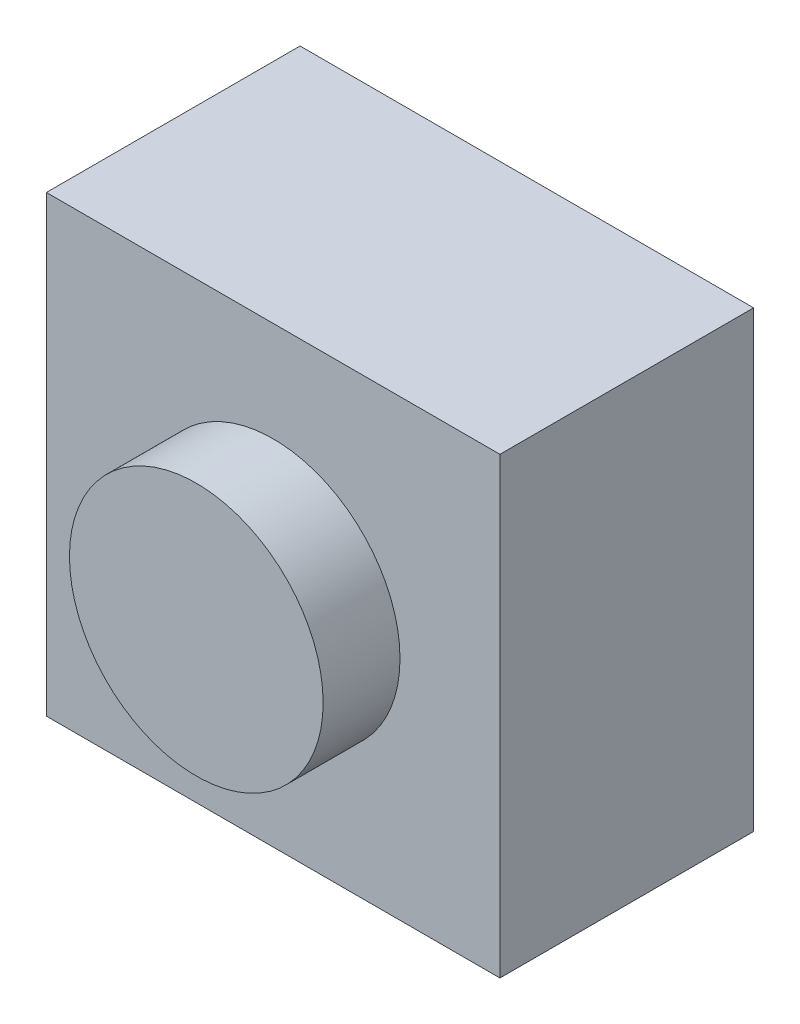
ISO-10303-21;
HEADER;
FILE_DESCRIPTION(('STEP AP214'),'2;1');
FILE_NAME('part.step','',(''),(''),'','','');
FILE_SCHEMA(('AUTOMOTIVE_DESIGN { 1 0 10303 214 1 1 1 1 }'));
ENDSEC;
DATA;
#1=APPLICATION_CONTEXT('core data for automotive mechanical design processes');
#2=APPLICATION_PROTOCOL_DEFINITION('international standard','automotive_design',2000,#1);
#3=PRODUCT_CONTEXT('',#1,'mechanical');
#4=PRODUCT('Part','Part','',(#3));
#5=PRODUCT_RELATED_PRODUCT_CATEGORY('part','',(#4));
#6=PRODUCT_DEFINITION_FORMATION('','',#4);
#7=PRODUCT_DEFINITION_CONTEXT('part definition',#1,'design');
#8=PRODUCT_DEFINITION('design','',#6,#7);
#9=PRODUCT_DEFINITION_SHAPE('','',#8);
#10=(LENGTH_UNIT() NAMED_UNIT(*) SI_UNIT(.MILLI.,.METRE.));
#11=(NAMED_UNIT(*) PLANE_ANGLE_UNIT() SI_UNIT($,.RADIAN.));
#12=(NAMED_UNIT(*) SI_UNIT($,.STERADIAN.) SOLID_ANGLE_UNIT());
#13=UNCERTAINTY_MEASURE_WITH_UNIT(LENGTH_MEASURE(1.E-05),#10,'distance_accuracy_value','');
#14=(GEOMETRIC_REPRESENTATION_CONTEXT(3) GLOBAL_UNCERTAINTY_ASSIGNED_CONTEXT((#13)) GLOBAL_UNIT_ASSIGNED_CONTEXT((#10,
#11,#12)) REPRESENTATION_CONTEXT('',''));
#15=CARTESIAN_POINT('',(0.,0.,0.));
#16=DIRECTION('',(0.,0.,1.));
#17=DIRECTION('',(1.,0.,0.));
#18=AXIS2_PLACEMENT_3D('',#15,#16,#17);
#19=CARTESIAN_POINT('',(2.95,2.95,3.3));
#20=DIRECTION('',(-1.,0.,0.));
#21=DIRECTION('',(0.,-1.,0.));
#22=AXIS2_PLACEMENT_3D('',#19,#20,#21);
#23=PLANE('',#22);
#24=DIRECTION('',(0.,1.,0.));
#25=VECTOR('',#24,1.);
#26=CARTESIAN_POINT('',(2.95,2.95,0.));
#27=LINE('',#26,#25);
#28=CARTESIAN_POINT('',(2.95,-2.95,0.));
#29=VERTEX_POINT('',#28);
#30=CARTESIAN_POINT('',(2.95,2.95,0.));
#31=VERTEX_POINT('',#30);
#32=EDGE_CURVE('E100',#29,#31,#27,.T.);
#33=ORIENTED_EDGE('',*,*,#32,.T.);
#34=DIRECTION('',(0.,0.,-1.));
#35=VECTOR('',#34,1.);
#36=CARTESIAN_POINT('',(2.95,2.95,3.3));
#37=LINE('',#36,#35);
#38=CARTESIAN_POINT('',(2.95,2.95,3.3));
#39=VERTEX_POINT('',#38);
#40=EDGE_CURVE('E11',#39,#31,#37,.T.);
#41=ORIENTED_EDGE('',*,*,#40,.F.);
#42=DIRECTION('',(0.,1.,0.));
#43=VECTOR('',#42,1.);
#44=CARTESIAN_POINT('',(2.95,2.95,3.3));
#45=LINE('',#44,#43);
#46=CARTESIAN_POINT('',(2.95,-2.95,3.3));
#47=VERTEX_POINT('',#46);
#48=EDGE_CURVE('E88',#47,#39,#45,.T.);
#49=ORIENTED_EDGE('',*,*,#48,.F.);
#50=DIRECTION('',(0.,0.,-1.));
#51=VECTOR('',#50,1.);
#52=CARTESIAN_POINT('',(2.95,-2.95,3.3));
#53=LINE('',#52,#51);
#54=EDGE_CURVE('E96',#47,#29,#53,.T.);
#55=ORIENTED_EDGE('',*,*,#54,.T.);
#56=EDGE_LOOP('',(#33,#41,#49,#55));
#57=FACE_BOUND('',#56,.T.);
#58=ADVANCED_FACE('F37',(#57),#23,.F.);
#59=CARTESIAN_POINT('',(-2.95,2.95,3.3));
#60=DIRECTION('',(0.,-1.,0.));
#61=DIRECTION('',(0.,0.,-1.));
#62=AXIS2_PLACEMENT_3D('',#59,#60,#61);
#63=PLANE('',#62);
#64=DIRECTION('',(-1.,0.,0.));
#65=VECTOR('',#64,1.);
#66=CARTESIAN_POINT('',(-2.95,2.95,0.));
#67=LINE('',#66,#65);
#68=CARTESIAN_POINT('',(-2.95,2.95,0.));
#69=VERTEX_POINT('',#68);
#70=EDGE_CURVE('E92',#31,#69,#67,.T.);
#71=ORIENTED_EDGE('',*,*,#70,.T.);
#72=DIRECTION('',(0.,0.,-1.));
#73=VECTOR('',#72,1.);
#74=CARTESIAN_POINT('',(-2.95,2.95,3.3));
#75=LINE('',#74,#73);
#76=CARTESIAN_POINT('',(-2.95,2.95,3.3));
#77=VERTEX_POINT('',#76);
#78=EDGE_CURVE('E45',#77,#69,#75,.T.);
#79=ORIENTED_EDGE('',*,*,#78,.F.);
#80=DIRECTION('',(-1.,0.,0.));
#81=VECTOR('',#80,1.);
#82=CARTESIAN_POINT('',(-2.95,2.95,3.3));
#83=LINE('',#82,#81);
#84=EDGE_CURVE('E83',#39,#77,#83,.T.);
#85=ORIENTED_EDGE('',*,*,#84,.F.);
#86=ORIENTED_EDGE('',*,*,#40,.T.);
#87=EDGE_LOOP('',(#71,#79,#85,#86));
#88=FACE_BOUND('',#87,.T.);
#89=ADVANCED_FACE('F91',(#88),#63,.F.);
#90=CARTESIAN_POINT('',(-2.95,2.95,3.3));
#91=DIRECTION('',(1.,0.,0.));
#92=DIRECTION('',(0.,1.,0.));
#93=AXIS2_PLACEMENT_3D('',#90,#91,#92);
#94=PLANE('',#93);
#95=DIRECTION('',(0.,-1.,0.));
#96=VECTOR('',#95,1.);
#97=CARTESIAN_POINT('',(-2.95,2.95,0.));
#98=LINE('',#97,#96);
#99=CARTESIAN_POINT('',(-2.95,-2.95,0.));
#100=VERTEX_POINT('',#99);
#101=EDGE_CURVE('E70',#69,#100,#98,.T.);
#102=ORIENTED_EDGE('',*,*,#101,.T.);
#103=DIRECTION('',(0.,0.,-1.));
#104=VECTOR('',#103,1.);
#105=CARTESIAN_POINT('',(-2.95,-2.95,3.3));
#106=LINE('',#105,#104);
#107=CARTESIAN_POINT('',(-2.95,-2.95,3.3));
#108=VERTEX_POINT('',#107);
#109=EDGE_CURVE('E93',#108,#100,#106,.T.);
#110=ORIENTED_EDGE('',*,*,#109,.F.);
#111=DIRECTION('',(0.,-1.,0.));
#112=VECTOR('',#111,1.);
#113=CARTESIAN_POINT('',(-2.95,2.95,3.3));
#114=LINE('',#113,#112);
#115=EDGE_CURVE('E86',#77,#108,#114,.T.);
#116=ORIENTED_EDGE('',*,*,#115,.F.);
#117=ORIENTED_EDGE('',*,*,#78,.T.);
#118=EDGE_LOOP('',(#102,#110,#116,#117));
#119=FACE_BOUND('',#118,.T.);
#120=ADVANCED_FACE('F94',(#119),#94,.F.);
#121=CARTESIAN_POINT('',(-2.95,-2.95,3.3));
#122=DIRECTION('',(0.,1.,0.));
#123=DIRECTION('',(0.,0.,1.));
#124=AXIS2_PLACEMENT_3D('',#121,#122,#123);
#125=PLANE('',#124);
#126=DIRECTION('',(1.,0.,0.));
#127=VECTOR('',#126,1.);
#128=CARTESIAN_POINT('',(-2.95,-2.95,0.));
#129=LINE('',#128,#127);
#130=EDGE_CURVE('E76',#100,#29,#129,.T.);
#131=ORIENTED_EDGE('',*,*,#130,.T.);
#132=ORIENTED_EDGE('',*,*,#54,.F.);
#133=DIRECTION('',(1.,0.,0.));
#134=VECTOR('',#133,1.);
#135=CARTESIAN_POINT('',(-2.95,-2.95,3.3));
#136=LINE('',#135,#134);
#137=EDGE_CURVE('E53',#108,#47,#136,.T.);
#138=ORIENTED_EDGE('',*,*,#137,.F.);
#139=ORIENTED_EDGE('',*,*,#109,.T.);
#140=EDGE_LOOP('',(#131,#132,#138,#139));
#141=FACE_BOUND('',#140,.T.);
#142=ADVANCED_FACE('F108',(#141),#125,.F.);
#143=CARTESIAN_POINT('',(0.,0.,3.3));
#144=DIRECTION('',(0.,0.,1.));
#145=DIRECTION('',(1.,0.,0.));
#146=AXIS2_PLACEMENT_3D('',#143,#144,#145);
#147=PLANE('',#146);
#148=CARTESIAN_POINT('',(0.,0.,3.3));
#149=DIRECTION('',(0.,0.,1.));
#150=DIRECTION('',(1.,0.,0.));
#151=AXIS2_PLACEMENT_3D('',#148,#149,#150);
#152=CIRCLE('',#151,1.65);
#153=CARTESIAN_POINT('',(1.65,0.,3.3));
#154=VERTEX_POINT('',#153);
#155=EDGE_CURVE('E114',#154,#154,#152,.T.);
#156=ORIENTED_EDGE('',*,*,#155,.F.);
#157=EDGE_LOOP('',(#156));
#158=FACE_BOUND('',#157,.T.);
#159=ORIENTED_EDGE('',*,*,#48,.T.);
#160=ORIENTED_EDGE('',*,*,#84,.T.);
#161=ORIENTED_EDGE('',*,*,#115,.T.);
#162=ORIENTED_EDGE('',*,*,#137,.T.);
#163=EDGE_LOOP('',(#159,#160,#161,#162));
#164=FACE_BOUND('',#163,.T.);
#165=ADVANCED_FACE('F84',(#158,#164),#147,.T.);
#166=CARTESIAN_POINT('',(0.,0.,0.));
#167=DIRECTION('',(0.,0.,1.));
#168=DIRECTION('',(1.,0.,0.));
#169=AXIS2_PLACEMENT_3D('',#166,#167,#168);
#170=PLANE('',#169);
#171=ORIENTED_EDGE('',*,*,#32,.F.);
#172=ORIENTED_EDGE('',*,*,#130,.F.);
#173=ORIENTED_EDGE('',*,*,#101,.F.);
#174=ORIENTED_EDGE('',*,*,#70,.F.);
#175=EDGE_LOOP('',(#171,#172,#173,#174));
#176=FACE_BOUND('',#175,.T.);
#177=ADVANCED_FACE('F111',(#176),#170,.F.);
#178=CARTESIAN_POINT('',(0.,0.,4.3));
#179=DIRECTION('',(0.,0.,-1.));
#180=DIRECTION('',(-1.,0.,0.));
#181=AXIS2_PLACEMENT_3D('',#178,#179,#180);
#182=CYLINDRICAL_SURFACE('',#181,1.65);
#183=CARTESIAN_POINT('',(0.,0.,4.3));
#184=DIRECTION('',(0.,0.,1.));
#185=DIRECTION('',(1.,0.,0.));
#186=AXIS2_PLACEMENT_3D('',#183,#184,#185);
#187=CIRCLE('',#186,1.65);
#188=CARTESIAN_POINT('',(1.65,0.,4.3));
#189=VERTEX_POINT('',#188);
#190=EDGE_CURVE('E103',#189,#189,#187,.T.);
#191=ORIENTED_EDGE('',*,*,#190,.F.);
#192=EDGE_LOOP('',(#191));
#193=FACE_BOUND('',#192,.T.);
#194=ORIENTED_EDGE('',*,*,#155,.T.);
#195=EDGE_LOOP('',(#194));
#196=FACE_BOUND('',#195,.T.);
#197=ADVANCED_FACE('F122',(#193,#196),#182,.T.);
#198=CARTESIAN_POINT('',(0.,0.,4.3));
#199=DIRECTION('',(0.,0.,1.));
#200=DIRECTION('',(1.,0.,0.));
#201=AXIS2_PLACEMENT_3D('',#198,#199,#200);
#202=PLANE('',#201);
#203=ORIENTED_EDGE('',*,*,#190,.T.);
#204=EDGE_LOOP('',(#203));
#205=FACE_BOUND('',#204,.T.);
#206=ADVANCED_FACE('F120',(#205),#202,.T.);
#207=CLOSED_SHELL('',(#58,#89,#120,#142,#165,#177,#197,#206));
#208=MANIFOLD_SOLID_BREP('B2',#207);
#209=ADVANCED_BREP_SHAPE_REPRESENTATION('',(#18,#208),#14);
#210=SHAPE_DEFINITION_REPRESENTATION(#9,#209);
ENDSEC;
END-ISO-10303-21;
